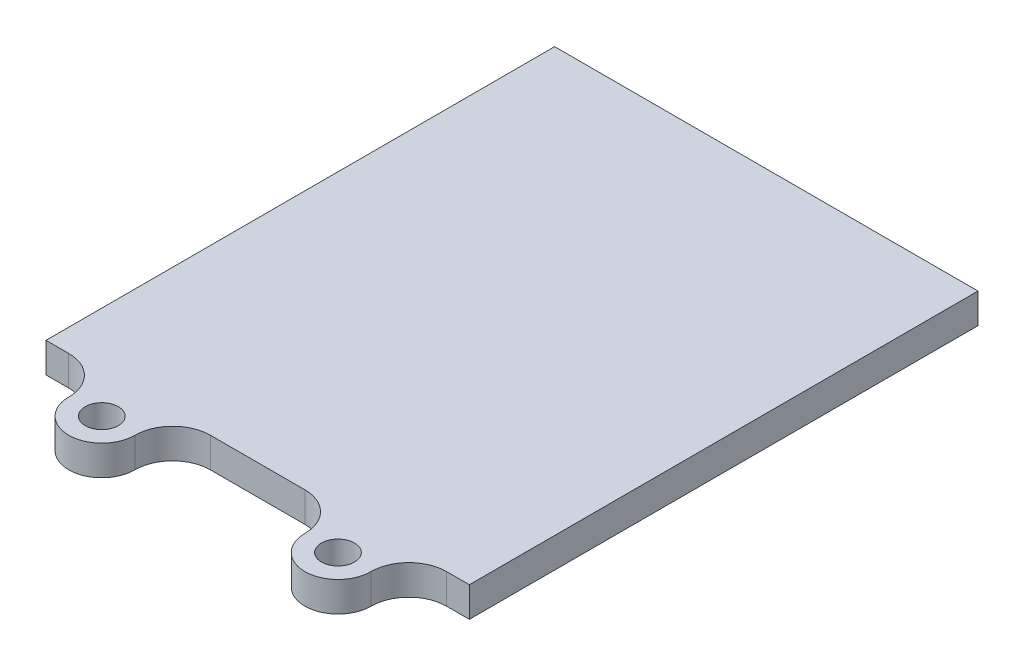
ISO-10303-21;
HEADER;
FILE_DESCRIPTION(('STEP AP214'),'2;1');
FILE_NAME('part.step','',(''),(''),'','','');
FILE_SCHEMA(('AUTOMOTIVE_DESIGN { 1 0 10303 214 1 1 1 1 }'));
ENDSEC;
DATA;
#1=APPLICATION_CONTEXT('core data for automotive mechanical design processes');
#2=APPLICATION_PROTOCOL_DEFINITION('international standard','automotive_design',2000,#1);
#3=PRODUCT_CONTEXT('',#1,'mechanical');
#4=PRODUCT('Part','Part','',(#3));
#5=PRODUCT_RELATED_PRODUCT_CATEGORY('part','',(#4));
#6=PRODUCT_DEFINITION_FORMATION('','',#4);
#7=PRODUCT_DEFINITION_CONTEXT('part definition',#1,'design');
#8=PRODUCT_DEFINITION('design','',#6,#7);
#9=PRODUCT_DEFINITION_SHAPE('','',#8);
#10=(LENGTH_UNIT() NAMED_UNIT(*) SI_UNIT(.MILLI.,.METRE.));
#11=(NAMED_UNIT(*) PLANE_ANGLE_UNIT() SI_UNIT($,.RADIAN.));
#12=(NAMED_UNIT(*) SI_UNIT($,.STERADIAN.) SOLID_ANGLE_UNIT());
#13=UNCERTAINTY_MEASURE_WITH_UNIT(LENGTH_MEASURE(1.E-05),#10,'distance_accuracy_value','');
#14=(GEOMETRIC_REPRESENTATION_CONTEXT(3) GLOBAL_UNCERTAINTY_ASSIGNED_CONTEXT((#13)) GLOBAL_UNIT_ASSIGNED_CONTEXT((#10,
#11,#12)) REPRESENTATION_CONTEXT('',''));
#15=CARTESIAN_POINT('',(0.,0.,0.));
#16=DIRECTION('',(0.,0.,1.));
#17=DIRECTION('',(1.,0.,0.));
#18=AXIS2_PLACEMENT_3D('',#15,#16,#17);
#19=CARTESIAN_POINT('',(44.815,6.35,53.85));
#20=DIRECTION('',(0.,0.,-1.));
#21=DIRECTION('',(-1.,0.,0.));
#22=AXIS2_PLACEMENT_3D('',#19,#20,#21);
#23=PLANE('',#22);
#24=DIRECTION('',(0.,-1.,0.));
#25=VECTOR('',#24,1.);
#26=CARTESIAN_POINT('',(-40.,6.35,53.85));
#27=LINE('',#26,#25);
#28=CARTESIAN_POINT('',(-40.,6.35,53.85));
#29=VERTEX_POINT('',#28);
#30=CARTESIAN_POINT('',(-40.,0.,53.85));
#31=VERTEX_POINT('',#30);
#32=EDGE_CURVE('E77',#29,#31,#27,.T.);
#33=ORIENTED_EDGE('',*,*,#32,.F.);
#34=DIRECTION('',(1.,0.,0.));
#35=VECTOR('',#34,1.);
#36=CARTESIAN_POINT('',(44.815,6.35,53.85));
#37=LINE('',#36,#35);
#38=CARTESIAN_POINT('',(-44.815,6.35,53.85));
#39=VERTEX_POINT('',#38);
#40=EDGE_CURVE('E223',#39,#29,#37,.T.);
#41=ORIENTED_EDGE('',*,*,#40,.F.);
#42=DIRECTION('',(0.,-1.,0.));
#43=VECTOR('',#42,1.);
#44=CARTESIAN_POINT('',(-44.815,6.35,53.85));
#45=LINE('',#44,#43);
#46=CARTESIAN_POINT('',(-44.815,0.,53.85));
#47=VERTEX_POINT('',#46);
#48=EDGE_CURVE('E12',#39,#47,#45,.T.);
#49=ORIENTED_EDGE('',*,*,#48,.T.);
#50=DIRECTION('',(1.,0.,0.));
#51=VECTOR('',#50,1.);
#52=CARTESIAN_POINT('',(44.815,0.,53.85));
#53=LINE('',#52,#51);
#54=EDGE_CURVE('E233',#47,#31,#53,.T.);
#55=ORIENTED_EDGE('',*,*,#54,.T.);
#56=EDGE_LOOP('',(#33,#41,#49,#55));
#57=FACE_BOUND('',#56,.T.);
#58=ADVANCED_FACE('F54',(#57),#23,.F.);
#59=DIRECTION('',(0.,-1.,0.));
#60=VECTOR('',#59,1.);
#61=CARTESIAN_POINT('',(-9.99999999999999,6.35,53.85));
#62=LINE('',#61,#60);
#63=CARTESIAN_POINT('',(-9.99999999999999,6.35,53.85));
#64=VERTEX_POINT('',#63);
#65=CARTESIAN_POINT('',(-9.99999999999999,0.,53.85));
#66=VERTEX_POINT('',#65);
#67=EDGE_CURVE('E175',#64,#66,#62,.T.);
#68=ORIENTED_EDGE('',*,*,#67,.T.);
#69=CARTESIAN_POINT('',(9.99999999999999,0.,53.85));
#70=VERTEX_POINT('',#69);
#71=EDGE_CURVE('E236',#66,#70,#53,.T.);
#72=ORIENTED_EDGE('',*,*,#71,.T.);
#73=DIRECTION('',(0.,-1.,0.));
#74=VECTOR('',#73,1.);
#75=CARTESIAN_POINT('',(9.99999999999999,6.35,53.85));
#76=LINE('',#75,#74);
#77=CARTESIAN_POINT('',(9.99999999999999,6.35,53.85));
#78=VERTEX_POINT('',#77);
#79=EDGE_CURVE('E211',#78,#70,#76,.T.);
#80=ORIENTED_EDGE('',*,*,#79,.F.);
#81=EDGE_CURVE('E69',#64,#78,#37,.T.);
#82=ORIENTED_EDGE('',*,*,#81,.F.);
#83=EDGE_LOOP('',(#68,#72,#80,#82));
#84=FACE_BOUND('',#83,.T.);
#85=ADVANCED_FACE('F268',(#84),#23,.F.);
#86=DIRECTION('',(0.,-1.,0.));
#87=VECTOR('',#86,1.);
#88=CARTESIAN_POINT('',(40.,6.35,53.85));
#89=LINE('',#88,#87);
#90=CARTESIAN_POINT('',(40.,6.35,53.85));
#91=VERTEX_POINT('',#90);
#92=CARTESIAN_POINT('',(40.,0.,53.85));
#93=VERTEX_POINT('',#92);
#94=EDGE_CURVE('E214',#91,#93,#89,.T.);
#95=ORIENTED_EDGE('',*,*,#94,.T.);
#96=CARTESIAN_POINT('',(44.815,0.,53.85));
#97=VERTEX_POINT('',#96);
#98=EDGE_CURVE('E232',#93,#97,#53,.T.);
#99=ORIENTED_EDGE('',*,*,#98,.T.);
#100=DIRECTION('',(0.,-1.,0.));
#101=VECTOR('',#100,1.);
#102=CARTESIAN_POINT('',(44.815,6.35,53.85));
#103=LINE('',#102,#101);
#104=CARTESIAN_POINT('',(44.815,6.35,53.85));
#105=VERTEX_POINT('',#104);
#106=EDGE_CURVE('E62',#105,#97,#103,.T.);
#107=ORIENTED_EDGE('',*,*,#106,.F.);
#108=EDGE_CURVE('E221',#91,#105,#37,.T.);
#109=ORIENTED_EDGE('',*,*,#108,.F.);
#110=EDGE_LOOP('',(#95,#99,#107,#109));
#111=FACE_BOUND('',#110,.T.);
#112=ADVANCED_FACE('F278',(#111),#23,.F.);
#113=CARTESIAN_POINT('',(-44.815,6.35,53.85));
#114=DIRECTION('',(1.,0.,0.));
#115=DIRECTION('',(0.,0.,-1.));
#116=AXIS2_PLACEMENT_3D('',#113,#114,#115);
#117=PLANE('',#116);
#118=DIRECTION('',(0.,0.,1.));
#119=VECTOR('',#118,1.);
#120=CARTESIAN_POINT('',(-44.815,0.,53.85));
#121=LINE('',#120,#119);
#122=CARTESIAN_POINT('',(-44.815,0.,-53.85));
#123=VERTEX_POINT('',#122);
#124=EDGE_CURVE('E217',#123,#47,#121,.T.);
#125=ORIENTED_EDGE('',*,*,#124,.T.);
#126=ORIENTED_EDGE('',*,*,#48,.F.);
#127=DIRECTION('',(0.,0.,1.));
#128=VECTOR('',#127,1.);
#129=CARTESIAN_POINT('',(-44.815,6.35,53.85));
#130=LINE('',#129,#128);
#131=CARTESIAN_POINT('',(-44.815,6.35,-53.85));
#132=VERTEX_POINT('',#131);
#133=EDGE_CURVE('E218',#132,#39,#130,.T.);
#134=ORIENTED_EDGE('',*,*,#133,.F.);
#135=DIRECTION('',(0.,-1.,0.));
#136=VECTOR('',#135,1.);
#137=CARTESIAN_POINT('',(-44.815,6.35,-53.85));
#138=LINE('',#137,#136);
#139=EDGE_CURVE('E229',#132,#123,#138,.T.);
#140=ORIENTED_EDGE('',*,*,#139,.T.);
#141=EDGE_LOOP('',(#125,#126,#134,#140));
#142=FACE_BOUND('',#141,.T.);
#143=ADVANCED_FACE('F56',(#142),#117,.F.);
#144=CARTESIAN_POINT('',(44.815,6.35,53.85));
#145=DIRECTION('',(-1.,0.,0.));
#146=DIRECTION('',(0.,0.,1.));
#147=AXIS2_PLACEMENT_3D('',#144,#145,#146);
#148=PLANE('',#147);
#149=DIRECTION('',(0.,0.,-1.));
#150=VECTOR('',#149,1.);
#151=CARTESIAN_POINT('',(44.815,0.,53.85));
#152=LINE('',#151,#150);
#153=CARTESIAN_POINT('',(44.815,0.,-53.85));
#154=VERTEX_POINT('',#153);
#155=EDGE_CURVE('E235',#97,#154,#152,.T.);
#156=ORIENTED_EDGE('',*,*,#155,.T.);
#157=DIRECTION('',(0.,-1.,0.));
#158=VECTOR('',#157,1.);
#159=CARTESIAN_POINT('',(44.815,6.35,-53.85));
#160=LINE('',#159,#158);
#161=CARTESIAN_POINT('',(44.815,6.35,-53.85));
#162=VERTEX_POINT('',#161);
#163=EDGE_CURVE('E241',#162,#154,#160,.T.);
#164=ORIENTED_EDGE('',*,*,#163,.F.);
#165=DIRECTION('',(0.,0.,-1.));
#166=VECTOR('',#165,1.);
#167=CARTESIAN_POINT('',(44.815,6.35,53.85));
#168=LINE('',#167,#166);
#169=EDGE_CURVE('E225',#105,#162,#168,.T.);
#170=ORIENTED_EDGE('',*,*,#169,.F.);
#171=ORIENTED_EDGE('',*,*,#106,.T.);
#172=EDGE_LOOP('',(#156,#164,#170,#171));
#173=FACE_BOUND('',#172,.T.);
#174=ADVANCED_FACE('F248',(#173),#148,.F.);
#175=CARTESIAN_POINT('',(44.815,6.35,-53.85));
#176=DIRECTION('',(0.,0.,1.));
#177=DIRECTION('',(1.,0.,0.));
#178=AXIS2_PLACEMENT_3D('',#175,#176,#177);
#179=PLANE('',#178);
#180=DIRECTION('',(-1.,0.,0.));
#181=VECTOR('',#180,1.);
#182=CARTESIAN_POINT('',(44.815,0.,-53.85));
#183=LINE('',#182,#181);
#184=EDGE_CURVE('E222',#154,#123,#183,.T.);
#185=ORIENTED_EDGE('',*,*,#184,.T.);
#186=ORIENTED_EDGE('',*,*,#139,.F.);
#187=DIRECTION('',(-1.,0.,0.));
#188=VECTOR('',#187,1.);
#189=CARTESIAN_POINT('',(44.815,6.35,-53.85));
#190=LINE('',#189,#188);
#191=EDGE_CURVE('E227',#162,#132,#190,.T.);
#192=ORIENTED_EDGE('',*,*,#191,.F.);
#193=ORIENTED_EDGE('',*,*,#163,.T.);
#194=EDGE_LOOP('',(#185,#186,#192,#193));
#195=FACE_BOUND('',#194,.T.);
#196=ADVANCED_FACE('F254',(#195),#179,.F.);
#197=CARTESIAN_POINT('',(0.,6.35,0.));
#198=DIRECTION('',(0.,1.,0.));
#199=DIRECTION('',(0.,0.,1.));
#200=AXIS2_PLACEMENT_3D('',#197,#198,#199);
#201=PLANE('',#200);
#202=ORIENTED_EDGE('',*,*,#133,.T.);
#203=ORIENTED_EDGE('',*,*,#40,.T.);
#204=CARTESIAN_POINT('',(-40.,6.35,61.85));
#205=DIRECTION('',(0.,-1.,0.));
#206=DIRECTION('',(0.,0.,-1.));
#207=AXIS2_PLACEMENT_3D('',#204,#205,#206);
#208=CIRCLE('',#207,8.);
#209=CARTESIAN_POINT('',(-32.,6.35,61.85));
#210=VERTEX_POINT('',#209);
#211=EDGE_CURVE('E173',#29,#210,#208,.T.);
#212=ORIENTED_EDGE('',*,*,#211,.T.);
#213=CARTESIAN_POINT('',(-25.,6.35,61.85));
#214=DIRECTION('',(0.,1.,0.));
#215=DIRECTION('',(0.,0.,1.));
#216=AXIS2_PLACEMENT_3D('',#213,#214,#215);
#217=CIRCLE('',#216,7.);
#218=CARTESIAN_POINT('',(-18.,6.35,61.85));
#219=VERTEX_POINT('',#218);
#220=EDGE_CURVE('E160',#210,#219,#217,.T.);
#221=ORIENTED_EDGE('',*,*,#220,.T.);
#222=CARTESIAN_POINT('',(-9.99999999999999,6.35,61.85));
#223=DIRECTION('',(0.,1.,0.));
#224=DIRECTION('',(0.,0.,1.));
#225=AXIS2_PLACEMENT_3D('',#222,#223,#224);
#226=CIRCLE('',#225,8.);
#227=EDGE_CURVE('E153',#64,#219,#226,.T.);
#228=ORIENTED_EDGE('',*,*,#227,.F.);
#229=ORIENTED_EDGE('',*,*,#81,.T.);
#230=CARTESIAN_POINT('',(9.99999999999999,6.35,61.85));
#231=DIRECTION('',(0.,1.,0.));
#232=DIRECTION('',(0.,0.,1.));
#233=AXIS2_PLACEMENT_3D('',#230,#231,#232);
#234=CIRCLE('',#233,8.);
#235=CARTESIAN_POINT('',(18.,6.35,61.85));
#236=VERTEX_POINT('',#235);
#237=EDGE_CURVE('E188',#78,#236,#234,.F.);
#238=ORIENTED_EDGE('',*,*,#237,.T.);
#239=CARTESIAN_POINT('',(25.,6.35,61.85));
#240=DIRECTION('',(0.,1.,0.));
#241=DIRECTION('',(0.,0.,1.));
#242=AXIS2_PLACEMENT_3D('',#239,#240,#241);
#243=CIRCLE('',#242,7.);
#244=CARTESIAN_POINT('',(32.,6.35,61.85));
#245=VERTEX_POINT('',#244);
#246=EDGE_CURVE('E191',#245,#236,#243,.F.);
#247=ORIENTED_EDGE('',*,*,#246,.F.);
#248=CARTESIAN_POINT('',(40.,6.35,61.85));
#249=DIRECTION('',(0.,1.,0.));
#250=DIRECTION('',(0.,0.,1.));
#251=AXIS2_PLACEMENT_3D('',#248,#249,#250);
#252=CIRCLE('',#251,8.);
#253=EDGE_CURVE('E185',#91,#245,#252,.T.);
#254=ORIENTED_EDGE('',*,*,#253,.F.);
#255=ORIENTED_EDGE('',*,*,#108,.T.);
#256=ORIENTED_EDGE('',*,*,#169,.T.);
#257=ORIENTED_EDGE('',*,*,#191,.T.);
#258=EDGE_LOOP('',(#202,#203,#212,#221,#228,#229,#238,#247,#254,#255,#256,#257));
#259=FACE_BOUND('',#258,.T.);
#260=CARTESIAN_POINT('',(25.,6.35,61.85));
#261=DIRECTION('',(0.,1.,0.));
#262=DIRECTION('',(0.,0.,1.));
#263=AXIS2_PLACEMENT_3D('',#260,#261,#262);
#264=CIRCLE('',#263,3.5);
#265=CARTESIAN_POINT('',(25.,6.35,65.35));
#266=VERTEX_POINT('',#265);
#267=EDGE_CURVE('E194',#266,#266,#264,.F.);
#268=ORIENTED_EDGE('',*,*,#267,.T.);
#269=EDGE_LOOP('',(#268));
#270=FACE_BOUND('',#269,.T.);
#271=CARTESIAN_POINT('',(-25.,6.35,61.85));
#272=DIRECTION('',(0.,1.,0.));
#273=DIRECTION('',(0.,0.,1.));
#274=AXIS2_PLACEMENT_3D('',#271,#272,#273);
#275=CIRCLE('',#274,3.5);
#276=CARTESIAN_POINT('',(-25.,6.35,65.35));
#277=VERTEX_POINT('',#276);
#278=EDGE_CURVE('E169',#277,#277,#275,.T.);
#279=ORIENTED_EDGE('',*,*,#278,.F.);
#280=EDGE_LOOP('',(#279));
#281=FACE_BOUND('',#280,.T.);
#282=ADVANCED_FACE('F260',(#259,#270,#281),#201,.T.);
#283=CARTESIAN_POINT('',(0.,0.,0.));
#284=DIRECTION('',(0.,1.,0.));
#285=DIRECTION('',(0.,0.,1.));
#286=AXIS2_PLACEMENT_3D('',#283,#284,#285);
#287=PLANE('',#286);
#288=ORIENTED_EDGE('',*,*,#124,.F.);
#289=ORIENTED_EDGE('',*,*,#184,.F.);
#290=ORIENTED_EDGE('',*,*,#155,.F.);
#291=ORIENTED_EDGE('',*,*,#98,.F.);
#292=CARTESIAN_POINT('',(40.,0.,61.85));
#293=DIRECTION('',(0.,1.,0.));
#294=DIRECTION('',(0.,0.,1.));
#295=AXIS2_PLACEMENT_3D('',#292,#293,#294);
#296=CIRCLE('',#295,8.);
#297=CARTESIAN_POINT('',(32.,0.,61.85));
#298=VERTEX_POINT('',#297);
#299=EDGE_CURVE('E182',#93,#298,#296,.T.);
#300=ORIENTED_EDGE('',*,*,#299,.T.);
#301=CARTESIAN_POINT('',(25.,0.,61.85));
#302=DIRECTION('',(0.,1.,0.));
#303=DIRECTION('',(0.,0.,1.));
#304=AXIS2_PLACEMENT_3D('',#301,#302,#303);
#305=CIRCLE('',#304,7.);
#306=CARTESIAN_POINT('',(18.,0.,61.85));
#307=VERTEX_POINT('',#306);
#308=EDGE_CURVE('E203',#298,#307,#305,.F.);
#309=ORIENTED_EDGE('',*,*,#308,.T.);
#310=CARTESIAN_POINT('',(9.99999999999999,0.,61.85));
#311=DIRECTION('',(0.,1.,0.));
#312=DIRECTION('',(0.,0.,1.));
#313=AXIS2_PLACEMENT_3D('',#310,#311,#312);
#314=CIRCLE('',#313,8.);
#315=EDGE_CURVE('E200',#70,#307,#314,.F.);
#316=ORIENTED_EDGE('',*,*,#315,.F.);
#317=ORIENTED_EDGE('',*,*,#71,.F.);
#318=CARTESIAN_POINT('',(-9.99999999999999,0.,61.85));
#319=DIRECTION('',(0.,1.,0.));
#320=DIRECTION('',(0.,0.,1.));
#321=AXIS2_PLACEMENT_3D('',#318,#319,#320);
#322=CIRCLE('',#321,8.);
#323=CARTESIAN_POINT('',(-18.,0.,61.85));
#324=VERTEX_POINT('',#323);
#325=EDGE_CURVE('E167',#66,#324,#322,.T.);
#326=ORIENTED_EDGE('',*,*,#325,.T.);
#327=CARTESIAN_POINT('',(-25.,0.,61.85));
#328=DIRECTION('',(0.,1.,0.));
#329=DIRECTION('',(0.,0.,1.));
#330=AXIS2_PLACEMENT_3D('',#327,#328,#329);
#331=CIRCLE('',#330,7.);
#332=CARTESIAN_POINT('',(-32.,0.,61.85));
#333=VERTEX_POINT('',#332);
#334=EDGE_CURVE('E152',#333,#324,#331,.T.);
#335=ORIENTED_EDGE('',*,*,#334,.F.);
#336=CARTESIAN_POINT('',(-40.,0.,61.85));
#337=DIRECTION('',(0.,-1.,0.));
#338=DIRECTION('',(0.,0.,-1.));
#339=AXIS2_PLACEMENT_3D('',#336,#337,#338);
#340=CIRCLE('',#339,8.);
#341=EDGE_CURVE('E144',#31,#333,#340,.T.);
#342=ORIENTED_EDGE('',*,*,#341,.F.);
#343=ORIENTED_EDGE('',*,*,#54,.F.);
#344=EDGE_LOOP('',(#288,#289,#290,#291,#300,#309,#316,#317,#326,#335,#342,#343));
#345=FACE_BOUND('',#344,.T.);
#346=CARTESIAN_POINT('',(25.,0.,61.85));
#347=DIRECTION('',(0.,1.,0.));
#348=DIRECTION('',(0.,0.,1.));
#349=AXIS2_PLACEMENT_3D('',#346,#347,#348);
#350=CIRCLE('',#349,3.5);
#351=CARTESIAN_POINT('',(25.,0.,65.35));
#352=VERTEX_POINT('',#351);
#353=EDGE_CURVE('E189',#352,#352,#350,.F.);
#354=ORIENTED_EDGE('',*,*,#353,.F.);
#355=EDGE_LOOP('',(#354));
#356=FACE_BOUND('',#355,.T.);
#357=CARTESIAN_POINT('',(-25.,0.,61.85));
#358=DIRECTION('',(0.,1.,0.));
#359=DIRECTION('',(0.,0.,1.));
#360=AXIS2_PLACEMENT_3D('',#357,#358,#359);
#361=CIRCLE('',#360,3.5);
#362=CARTESIAN_POINT('',(-25.,0.,65.35));
#363=VERTEX_POINT('',#362);
#364=EDGE_CURVE('E179',#363,#363,#361,.T.);
#365=ORIENTED_EDGE('',*,*,#364,.T.);
#366=EDGE_LOOP('',(#365));
#367=FACE_BOUND('',#366,.T.);
#368=ADVANCED_FACE('F164',(#345,#356,#367),#287,.F.);
#369=CARTESIAN_POINT('',(40.,6.35,61.85));
#370=DIRECTION('',(0.,-1.,0.));
#371=DIRECTION('',(0.,0.,-1.));
#372=AXIS2_PLACEMENT_3D('',#369,#370,#371);
#373=CYLINDRICAL_SURFACE('',#372,8.);
#374=ORIENTED_EDGE('',*,*,#299,.F.);
#375=ORIENTED_EDGE('',*,*,#94,.F.);
#376=ORIENTED_EDGE('',*,*,#253,.T.);
#377=DIRECTION('',(0.,-1.,0.));
#378=VECTOR('',#377,1.);
#379=CARTESIAN_POINT('',(32.,6.35,61.85));
#380=LINE('',#379,#378);
#381=EDGE_CURVE('E197',#245,#298,#380,.T.);
#382=ORIENTED_EDGE('',*,*,#381,.T.);
#383=EDGE_LOOP('',(#374,#375,#376,#382));
#384=FACE_BOUND('',#383,.T.);
#385=ADVANCED_FACE('F277',(#384),#373,.F.);
#386=CARTESIAN_POINT('',(9.99999999999999,6.35,61.85));
#387=DIRECTION('',(0.,-1.,0.));
#388=DIRECTION('',(0.,0.,-1.));
#389=AXIS2_PLACEMENT_3D('',#386,#387,#388);
#390=CYLINDRICAL_SURFACE('',#389,8.);
#391=ORIENTED_EDGE('',*,*,#315,.T.);
#392=DIRECTION('',(0.,-1.,0.));
#393=VECTOR('',#392,1.);
#394=CARTESIAN_POINT('',(18.,6.35,61.85));
#395=LINE('',#394,#393);
#396=EDGE_CURVE('E209',#236,#307,#395,.T.);
#397=ORIENTED_EDGE('',*,*,#396,.F.);
#398=ORIENTED_EDGE('',*,*,#237,.F.);
#399=ORIENTED_EDGE('',*,*,#79,.T.);
#400=EDGE_LOOP('',(#391,#397,#398,#399));
#401=FACE_BOUND('',#400,.T.);
#402=ADVANCED_FACE('F271',(#401),#390,.F.);
#403=CARTESIAN_POINT('',(25.,6.35,61.85));
#404=DIRECTION('',(0.,-1.,0.));
#405=DIRECTION('',(0.,0.,-1.));
#406=AXIS2_PLACEMENT_3D('',#403,#404,#405);
#407=CYLINDRICAL_SURFACE('',#406,7.);
#408=ORIENTED_EDGE('',*,*,#308,.F.);
#409=ORIENTED_EDGE('',*,*,#381,.F.);
#410=ORIENTED_EDGE('',*,*,#246,.T.);
#411=ORIENTED_EDGE('',*,*,#396,.T.);
#412=EDGE_LOOP('',(#408,#409,#410,#411));
#413=FACE_BOUND('',#412,.T.);
#414=ADVANCED_FACE('F274',(#413),#407,.T.);
#415=CARTESIAN_POINT('',(25.,6.35,61.85));
#416=DIRECTION('',(0.,-1.,0.));
#417=DIRECTION('',(0.,0.,-1.));
#418=AXIS2_PLACEMENT_3D('',#415,#416,#417);
#419=CYLINDRICAL_SURFACE('',#418,3.5);
#420=ORIENTED_EDGE('',*,*,#267,.F.);
#421=EDGE_LOOP('',(#420));
#422=FACE_BOUND('',#421,.T.);
#423=ORIENTED_EDGE('',*,*,#353,.T.);
#424=EDGE_LOOP('',(#423));
#425=FACE_BOUND('',#424,.T.);
#426=ADVANCED_FACE('F345',(#422,#425),#419,.F.);
#427=CARTESIAN_POINT('',(-40.,6.35,61.85));
#428=DIRECTION('',(0.,-1.,0.));
#429=DIRECTION('',(0.,0.,-1.));
#430=AXIS2_PLACEMENT_3D('',#427,#428,#429);
#431=CYLINDRICAL_SURFACE('',#430,8.);
#432=ORIENTED_EDGE('',*,*,#341,.T.);
#433=DIRECTION('',(0.,-1.,0.));
#434=VECTOR('',#433,1.);
#435=CARTESIAN_POINT('',(-32.,6.35,61.85));
#436=LINE('',#435,#434);
#437=EDGE_CURVE('E148',#210,#333,#436,.T.);
#438=ORIENTED_EDGE('',*,*,#437,.F.);
#439=ORIENTED_EDGE('',*,*,#211,.F.);
#440=ORIENTED_EDGE('',*,*,#32,.T.);
#441=EDGE_LOOP('',(#432,#438,#439,#440));
#442=FACE_BOUND('',#441,.T.);
#443=ADVANCED_FACE('F146',(#442),#431,.F.);
#444=CARTESIAN_POINT('',(-25.,6.35,61.85));
#445=DIRECTION('',(0.,-1.,0.));
#446=DIRECTION('',(0.,0.,-1.));
#447=AXIS2_PLACEMENT_3D('',#444,#445,#446);
#448=CYLINDRICAL_SURFACE('',#447,7.);
#449=ORIENTED_EDGE('',*,*,#334,.T.);
#450=DIRECTION('',(0.,-1.,0.));
#451=VECTOR('',#450,1.);
#452=CARTESIAN_POINT('',(-18.,6.35,61.85));
#453=LINE('',#452,#451);
#454=EDGE_CURVE('E161',#219,#324,#453,.T.);
#455=ORIENTED_EDGE('',*,*,#454,.F.);
#456=ORIENTED_EDGE('',*,*,#220,.F.);
#457=ORIENTED_EDGE('',*,*,#437,.T.);
#458=EDGE_LOOP('',(#449,#455,#456,#457));
#459=FACE_BOUND('',#458,.T.);
#460=ADVANCED_FACE('F157',(#459),#448,.T.);
#461=CARTESIAN_POINT('',(-9.99999999999999,6.35,61.85));
#462=DIRECTION('',(0.,-1.,0.));
#463=DIRECTION('',(0.,0.,-1.));
#464=AXIS2_PLACEMENT_3D('',#461,#462,#463);
#465=CYLINDRICAL_SURFACE('',#464,8.);
#466=ORIENTED_EDGE('',*,*,#325,.F.);
#467=ORIENTED_EDGE('',*,*,#67,.F.);
#468=ORIENTED_EDGE('',*,*,#227,.T.);
#469=ORIENTED_EDGE('',*,*,#454,.T.);
#470=EDGE_LOOP('',(#466,#467,#468,#469));
#471=FACE_BOUND('',#470,.T.);
#472=ADVANCED_FACE('F374',(#471),#465,.F.);
#473=CARTESIAN_POINT('',(-25.,6.35,61.85));
#474=DIRECTION('',(0.,-1.,0.));
#475=DIRECTION('',(0.,0.,-1.));
#476=AXIS2_PLACEMENT_3D('',#473,#474,#475);
#477=CYLINDRICAL_SURFACE('',#476,3.5);
#478=ORIENTED_EDGE('',*,*,#278,.T.);
#479=EDGE_LOOP('',(#478));
#480=FACE_BOUND('',#479,.T.);
#481=ORIENTED_EDGE('',*,*,#364,.F.);
#482=EDGE_LOOP('',(#481));
#483=FACE_BOUND('',#482,.T.);
#484=ADVANCED_FACE('F384',(#480,#483),#477,.F.);
#485=CLOSED_SHELL('',(#58,#85,#112,#143,#174,#196,#282,#368,#385,#402,#414,#426,#443,#460,#472,#484));
#486=MANIFOLD_SOLID_BREP('B2',#485);
#487=ADVANCED_BREP_SHAPE_REPRESENTATION('',(#18,#486),#14);
#488=SHAPE_DEFINITION_REPRESENTATION(#9,#487);
ENDSEC;
END-ISO-10303-21;
